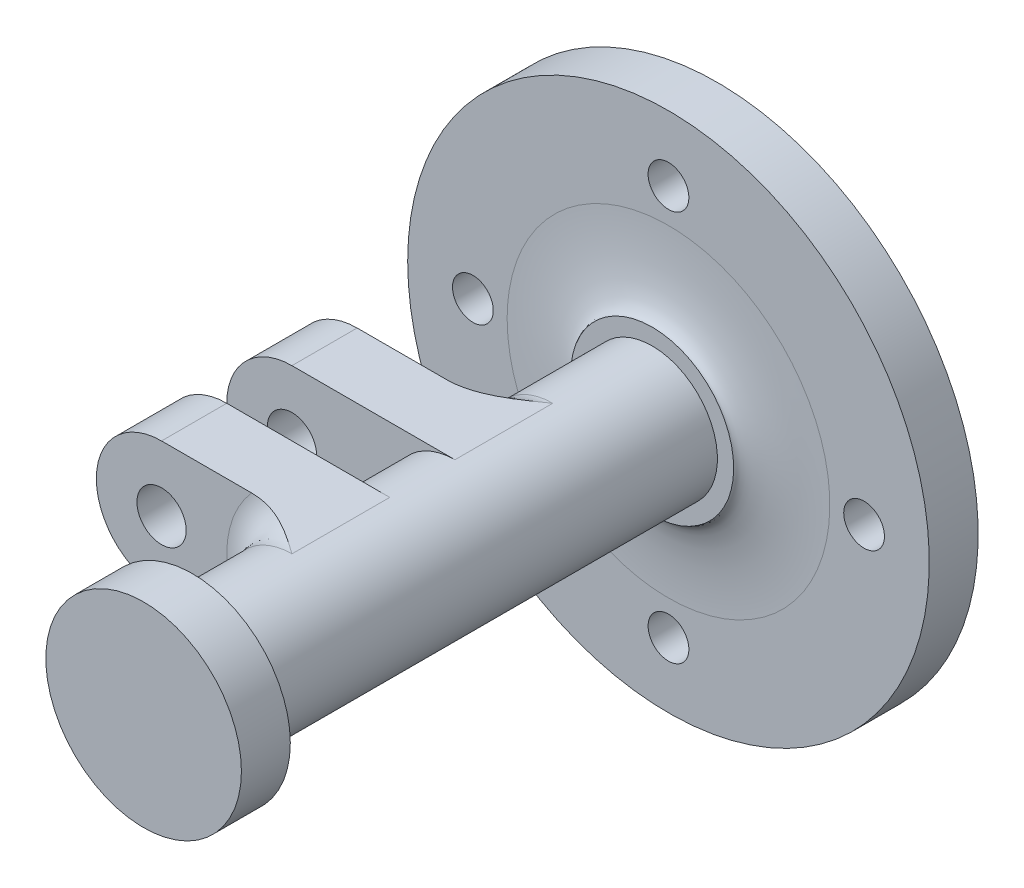
ISO-10303-21;
HEADER;
FILE_DESCRIPTION(('STEP AP214'),'2;1');
FILE_NAME('part.step','',(''),(''),'','','');
FILE_SCHEMA(('AUTOMOTIVE_DESIGN { 1 0 10303 214 1 1 1 1 }'));
ENDSEC;
DATA;
#1=APPLICATION_CONTEXT('core data for automotive mechanical design processes');
#2=APPLICATION_PROTOCOL_DEFINITION('international standard','automotive_design',2000,#1);
#3=PRODUCT_CONTEXT('',#1,'mechanical');
#4=PRODUCT('Part','Part','',(#3));
#5=PRODUCT_RELATED_PRODUCT_CATEGORY('part','',(#4));
#6=PRODUCT_DEFINITION_FORMATION('','',#4);
#7=PRODUCT_DEFINITION_CONTEXT('part definition',#1,'design');
#8=PRODUCT_DEFINITION('design','',#6,#7);
#9=PRODUCT_DEFINITION_SHAPE('','',#8);
#10=(LENGTH_UNIT() NAMED_UNIT(*) SI_UNIT(.MILLI.,.METRE.));
#11=(NAMED_UNIT(*) PLANE_ANGLE_UNIT() SI_UNIT($,.RADIAN.));
#12=(NAMED_UNIT(*) SI_UNIT($,.STERADIAN.) SOLID_ANGLE_UNIT());
#13=UNCERTAINTY_MEASURE_WITH_UNIT(LENGTH_MEASURE(1.E-05),#10,'distance_accuracy_value','');
#14=(GEOMETRIC_REPRESENTATION_CONTEXT(3) GLOBAL_UNCERTAINTY_ASSIGNED_CONTEXT((#13)) GLOBAL_UNIT_ASSIGNED_CONTEXT((#10,
#11,#12)) REPRESENTATION_CONTEXT('',''));
#15=CARTESIAN_POINT('',(0.,0.,0.));
#16=DIRECTION('',(0.,0.,1.));
#17=DIRECTION('',(1.,0.,0.));
#18=AXIS2_PLACEMENT_3D('',#15,#16,#17);
#19=CARTESIAN_POINT('',(0.,0.,14.1));
#20=DIRECTION('',(0.,0.,-1.));
#21=DIRECTION('',(-1.,0.,0.));
#22=AXIS2_PLACEMENT_3D('',#19,#20,#21);
#23=CYLINDRICAL_SURFACE('',#22,4.);
#24=CARTESIAN_POINT('',(0.,0.,-8.));
#25=DIRECTION('',(0.,0.,-1.));
#26=DIRECTION('',(-1.,0.,0.));
#27=AXIS2_PLACEMENT_3D('',#24,#25,#26);
#28=CIRCLE('',#27,4.);
#29=CARTESIAN_POINT('',(0.,-4.,-8.));
#30=VERTEX_POINT('',#29);
#31=CARTESIAN_POINT('',(0.,4.,-8.));
#32=VERTEX_POINT('',#31);
#33=EDGE_CURVE('E220',#30,#32,#28,.T.);
#34=ORIENTED_EDGE('',*,*,#33,.T.);
#35=DIRECTION('',(0.,0.,1.));
#36=VECTOR('',#35,1.);
#37=CARTESIAN_POINT('',(0.,4.,-6.));
#38=LINE('',#37,#36);
#39=CARTESIAN_POINT('',(0.,4.,-2.));
#40=VERTEX_POINT('',#39);
#41=EDGE_CURVE('E154',#32,#40,#38,.T.);
#42=ORIENTED_EDGE('',*,*,#41,.T.);
#43=CARTESIAN_POINT('',(0.,0.,-2.));
#44=DIRECTION('',(0.,0.,-1.));
#45=DIRECTION('',(-1.,0.,0.));
#46=AXIS2_PLACEMENT_3D('',#43,#44,#45);
#47=CIRCLE('',#46,4.);
#48=CARTESIAN_POINT('',(0.,-4.,-2.));
#49=VERTEX_POINT('',#48);
#50=EDGE_CURVE('E214',#49,#40,#47,.T.);
#51=ORIENTED_EDGE('',*,*,#50,.F.);
#52=DIRECTION('',(0.,0.,1.));
#53=VECTOR('',#52,1.);
#54=CARTESIAN_POINT('',(0.,-4.,-6.));
#55=LINE('',#54,#53);
#56=EDGE_CURVE('E147',#30,#49,#55,.T.);
#57=ORIENTED_EDGE('',*,*,#56,.F.);
#58=EDGE_LOOP('',(#34,#42,#51,#57));
#59=FACE_BOUND('',#58,.T.);
#60=CARTESIAN_POINT('',(0.,0.,-14.1));
#61=DIRECTION('',(0.,0.,-1.));
#62=DIRECTION('',(-1.,0.,0.));
#63=AXIS2_PLACEMENT_3D('',#60,#61,#62);
#64=CIRCLE('',#63,4.);
#65=CARTESIAN_POINT('',(-4.,0.,-14.1));
#66=VERTEX_POINT('',#65);
#67=EDGE_CURVE('E167',#66,#66,#64,.T.);
#68=ORIENTED_EDGE('',*,*,#67,.F.);
#69=EDGE_LOOP('',(#68));
#70=FACE_BOUND('',#69,.T.);
#71=CARTESIAN_POINT('',(0.,0.,14.1));
#72=DIRECTION('',(0.,0.,1.));
#73=DIRECTION('',(1.,0.,0.));
#74=AXIS2_PLACEMENT_3D('',#71,#72,#73);
#75=CIRCLE('',#74,4.);
#76=CARTESIAN_POINT('',(4.,0.,14.1));
#77=VERTEX_POINT('',#76);
#78=EDGE_CURVE('E206',#77,#77,#75,.T.);
#79=ORIENTED_EDGE('',*,*,#78,.F.);
#80=EDGE_LOOP('',(#79));
#81=FACE_BOUND('',#80,.T.);
#82=DIRECTION('',(0.,0.,-1.));
#83=VECTOR('',#82,1.);
#84=CARTESIAN_POINT('',(0.,4.,6.));
#85=LINE('',#84,#83);
#86=CARTESIAN_POINT('',(0.,4.,8.));
#87=VERTEX_POINT('',#86);
#88=CARTESIAN_POINT('',(0.,4.,2.));
#89=VERTEX_POINT('',#88);
#90=EDGE_CURVE('E199',#87,#89,#85,.T.);
#91=ORIENTED_EDGE('',*,*,#90,.F.);
#92=CARTESIAN_POINT('',(0.,0.,8.));
#93=DIRECTION('',(0.,0.,-1.));
#94=DIRECTION('',(-1.,0.,0.));
#95=AXIS2_PLACEMENT_3D('',#92,#93,#94);
#96=CIRCLE('',#95,4.);
#97=CARTESIAN_POINT('',(0.,-4.,8.));
#98=VERTEX_POINT('',#97);
#99=EDGE_CURVE('E223',#87,#98,#96,.F.);
#100=ORIENTED_EDGE('',*,*,#99,.T.);
#101=DIRECTION('',(0.,0.,-1.));
#102=VECTOR('',#101,1.);
#103=CARTESIAN_POINT('',(0.,-4.,6.));
#104=LINE('',#103,#102);
#105=CARTESIAN_POINT('',(0.,-4.,2.));
#106=VERTEX_POINT('',#105);
#107=EDGE_CURVE('E196',#98,#106,#104,.T.);
#108=ORIENTED_EDGE('',*,*,#107,.T.);
#109=CARTESIAN_POINT('',(0.,0.,2.));
#110=DIRECTION('',(0.,0.,-1.));
#111=DIRECTION('',(-1.,0.,0.));
#112=AXIS2_PLACEMENT_3D('',#109,#110,#111);
#113=CIRCLE('',#112,4.);
#114=EDGE_CURVE('E211',#106,#89,#113,.T.);
#115=ORIENTED_EDGE('',*,*,#114,.T.);
#116=EDGE_LOOP('',(#91,#100,#108,#115));
#117=FACE_BOUND('',#116,.T.);
#118=ADVANCED_FACE('F45',(#59,#70,#81,#117),#23,.T.);
#119=CARTESIAN_POINT('',(0.,0.,17.1));
#120=DIRECTION('',(0.,0.,-1.));
#121=DIRECTION('',(-1.,0.,0.));
#122=AXIS2_PLACEMENT_3D('',#119,#120,#121);
#123=CYLINDRICAL_SURFACE('',#122,6.);
#124=CARTESIAN_POINT('',(0.,0.,17.1));
#125=DIRECTION('',(0.,0.,1.));
#126=DIRECTION('',(1.,0.,0.));
#127=AXIS2_PLACEMENT_3D('',#124,#125,#126);
#128=CIRCLE('',#127,6.);
#129=CARTESIAN_POINT('',(6.,0.,17.1));
#130=VERTEX_POINT('',#129);
#131=EDGE_CURVE('E203',#130,#130,#128,.T.);
#132=ORIENTED_EDGE('',*,*,#131,.F.);
#133=EDGE_LOOP('',(#132));
#134=FACE_BOUND('',#133,.T.);
#135=CARTESIAN_POINT('',(0.,0.,14.1));
#136=DIRECTION('',(0.,0.,1.));
#137=DIRECTION('',(1.,0.,0.));
#138=AXIS2_PLACEMENT_3D('',#135,#136,#137);
#139=CIRCLE('',#138,6.);
#140=CARTESIAN_POINT('',(6.,0.,14.1));
#141=VERTEX_POINT('',#140);
#142=EDGE_CURVE('E195',#141,#141,#139,.T.);
#143=ORIENTED_EDGE('',*,*,#142,.T.);
#144=EDGE_LOOP('',(#143));
#145=FACE_BOUND('',#144,.T.);
#146=ADVANCED_FACE('F263',(#134,#145),#123,.T.);
#147=CARTESIAN_POINT('',(0.,0.,17.1));
#148=DIRECTION('',(0.,0.,1.));
#149=DIRECTION('',(1.,0.,0.));
#150=AXIS2_PLACEMENT_3D('',#147,#148,#149);
#151=PLANE('',#150);
#152=ORIENTED_EDGE('',*,*,#131,.T.);
#153=EDGE_LOOP('',(#152));
#154=FACE_BOUND('',#153,.T.);
#155=ADVANCED_FACE('F260',(#154),#151,.T.);
#156=CARTESIAN_POINT('',(0.,0.,14.1));
#157=DIRECTION('',(0.,0.,1.));
#158=DIRECTION('',(1.,0.,0.));
#159=AXIS2_PLACEMENT_3D('',#156,#157,#158);
#160=PLANE('',#159);
#161=ORIENTED_EDGE('',*,*,#78,.T.);
#162=EDGE_LOOP('',(#161));
#163=FACE_BOUND('',#162,.T.);
#164=ORIENTED_EDGE('',*,*,#142,.F.);
#165=EDGE_LOOP('',(#164));
#166=FACE_BOUND('',#165,.T.);
#167=ADVANCED_FACE('F258',(#163,#166),#160,.F.);
#168=CARTESIAN_POINT('',(-10.,0.,6.));
#169=DIRECTION('',(0.,0.,-1.));
#170=DIRECTION('',(-1.,0.,0.));
#171=AXIS2_PLACEMENT_3D('',#168,#169,#170);
#172=CYLINDRICAL_SURFACE('',#171,4.);
#173=CARTESIAN_POINT('',(-10.,0.,2.));
#174=DIRECTION('',(0.,0.,-1.));
#175=DIRECTION('',(-1.,0.,0.));
#176=AXIS2_PLACEMENT_3D('',#173,#174,#175);
#177=CIRCLE('',#176,4.);
#178=CARTESIAN_POINT('',(-10.,-4.,2.));
#179=VERTEX_POINT('',#178);
#180=CARTESIAN_POINT('',(-10.,4.,2.));
#181=VERTEX_POINT('',#180);
#182=EDGE_CURVE('E174',#179,#181,#177,.T.);
#183=ORIENTED_EDGE('',*,*,#182,.F.);
#184=DIRECTION('',(0.,0.,-1.));
#185=VECTOR('',#184,1.);
#186=CARTESIAN_POINT('',(-10.,-4.,6.));
#187=LINE('',#186,#185);
#188=CARTESIAN_POINT('',(-10.,-4.,6.));
#189=VERTEX_POINT('',#188);
#190=EDGE_CURVE('E193',#189,#179,#187,.T.);
#191=ORIENTED_EDGE('',*,*,#190,.F.);
#192=CARTESIAN_POINT('',(-10.,0.,6.));
#193=DIRECTION('',(0.,0.,-1.));
#194=DIRECTION('',(-1.,0.,0.));
#195=AXIS2_PLACEMENT_3D('',#192,#193,#194);
#196=CIRCLE('',#195,4.);
#197=CARTESIAN_POINT('',(-10.,4.,6.));
#198=VERTEX_POINT('',#197);
#199=EDGE_CURVE('E177',#189,#198,#196,.T.);
#200=ORIENTED_EDGE('',*,*,#199,.T.);
#201=DIRECTION('',(0.,0.,-1.));
#202=VECTOR('',#201,1.);
#203=CARTESIAN_POINT('',(-10.,4.,6.));
#204=LINE('',#203,#202);
#205=EDGE_CURVE('E186',#198,#181,#204,.T.);
#206=ORIENTED_EDGE('',*,*,#205,.T.);
#207=EDGE_LOOP('',(#183,#191,#200,#206));
#208=FACE_BOUND('',#207,.T.);
#209=ADVANCED_FACE('F255',(#208),#172,.T.);
#210=CARTESIAN_POINT('',(-10.,-4.,6.));
#211=DIRECTION('',(0.,-1.,0.));
#212=DIRECTION('',(0.,0.,-1.));
#213=AXIS2_PLACEMENT_3D('',#210,#211,#212);
#214=PLANE('',#213);
#215=DIRECTION('',(-1.,0.,0.));
#216=VECTOR('',#215,1.);
#217=CARTESIAN_POINT('',(-10.,-4.,2.));
#218=LINE('',#217,#216);
#219=EDGE_CURVE('E181',#106,#179,#218,.T.);
#220=ORIENTED_EDGE('',*,*,#219,.F.);
#221=ORIENTED_EDGE('',*,*,#107,.F.);
#222=CARTESIAN_POINT('',(-4.47213595499958,-4.,6.));
#223=CARTESIAN_POINT('',(-4.35334359731727,-4.,6.00001024401907));
#224=CARTESIAN_POINT('',(-4.23469314670311,-4.,6.00587622658887));
#225=CARTESIAN_POINT('',(-3.99859891424026,-4.,6.02808665591263));
#226=CARTESIAN_POINT('',(-3.88115319741225,-4.,6.04441017611719));
#227=CARTESIAN_POINT('',(-3.53520291074407,-4.,6.10656076269327));
#228=CARTESIAN_POINT('',(-3.30906372489476,-4.,6.16565492945821));
#229=CARTESIAN_POINT('',(-2.84508071295032,-4.,6.31803538332929));
#230=CARTESIAN_POINT('',(-2.60817008180991,-4.,6.41403969988759));
#231=CARTESIAN_POINT('',(-2.14516709447212,-4.,6.62957478686055));
#232=CARTESIAN_POINT('',(-1.91909148826652,-4.,6.74914060984285));
#233=CARTESIAN_POINT('',(-1.47418805175543,-4.,7.00514512317495));
#234=CARTESIAN_POINT('',(-1.25544428549517,-4.,7.14172666252827));
#235=CARTESIAN_POINT('',(-0.824306852386631,-4.,7.42418284041456));
#236=CARTESIAN_POINT('',(-0.611910368567943,-4.,7.57005326370043));
#237=CARTESIAN_POINT('',(-0.270297196766632,-3.99999999999999,7.80889896384493));
#238=CARTESIAN_POINT('',(-0.14030705977901,-3.99999999999999,7.9007886474796));
#239=CARTESIAN_POINT('',(-0.00688530460870534,-4.,7.9951313540674));
#240=CARTESIAN_POINT('',(-0.00344265276683976,-4.,7.99756567652484));
#241=CARTESIAN_POINT('',(0.,-4.,8.));
#242=B_SPLINE_CURVE_WITH_KNOTS('',3,(#222,#223,#224,#225,#226,#227,#228,#229,#230,#231,#232,
#233,#234,#235,#236,#237,#238,#239,#240,#241),.UNSPECIFIED.,.F.,.F.,(4,2,2,2,2,2,2,2,2,4),(0.,
0.356013544585943,0.711316887353405,1.41000592210095,2.17516485328382,2.94147082800576,
3.71470886546806,4.48759847817231,4.96517109874123,4.97782020938191),.UNSPECIFIED.);
#243=CARTESIAN_POINT('',(-4.47213595499958,-4.,6.));
#244=VERTEX_POINT('',#243);
#245=EDGE_CURVE('E236',#98,#244,#242,.F.);
#246=ORIENTED_EDGE('',*,*,#245,.T.);
#247=DIRECTION('',(-1.,0.,0.));
#248=VECTOR('',#247,1.);
#249=CARTESIAN_POINT('',(-10.,-4.,6.));
#250=LINE('',#249,#248);
#251=EDGE_CURVE('E184',#244,#189,#250,.T.);
#252=ORIENTED_EDGE('',*,*,#251,.T.);
#253=ORIENTED_EDGE('',*,*,#190,.T.);
#254=EDGE_LOOP('',(#220,#221,#246,#252,#253));
#255=FACE_BOUND('',#254,.T.);
#256=ADVANCED_FACE('F251',(#255),#214,.T.);
#257=CARTESIAN_POINT('',(-10.,4.,6.));
#258=DIRECTION('',(0.,1.,0.));
#259=DIRECTION('',(0.,0.,1.));
#260=AXIS2_PLACEMENT_3D('',#257,#258,#259);
#261=PLANE('',#260);
#262=DIRECTION('',(1.,0.,0.));
#263=VECTOR('',#262,1.);
#264=CARTESIAN_POINT('',(-10.,4.,2.));
#265=LINE('',#264,#263);
#266=EDGE_CURVE('E189',#181,#89,#265,.T.);
#267=ORIENTED_EDGE('',*,*,#266,.F.);
#268=ORIENTED_EDGE('',*,*,#205,.F.);
#269=DIRECTION('',(1.,0.,0.));
#270=VECTOR('',#269,1.);
#271=CARTESIAN_POINT('',(-10.,4.,6.));
#272=LINE('',#271,#270);
#273=CARTESIAN_POINT('',(-4.47213595499958,4.,6.));
#274=VERTEX_POINT('',#273);
#275=EDGE_CURVE('E180',#198,#274,#272,.T.);
#276=ORIENTED_EDGE('',*,*,#275,.T.);
#277=CARTESIAN_POINT('',(-4.47213595499958,4.,6.));
#278=CARTESIAN_POINT('',(-4.35334359731727,4.,6.00001024401907));
#279=CARTESIAN_POINT('',(-4.23469314670311,4.,6.00587622658887));
#280=CARTESIAN_POINT('',(-3.99859891424026,4.,6.02808665591263));
#281=CARTESIAN_POINT('',(-3.88115319741225,4.,6.04441017611719));
#282=CARTESIAN_POINT('',(-3.53520291074407,4.,6.10656076269327));
#283=CARTESIAN_POINT('',(-3.30906372489476,4.,6.16565492945821));
#284=CARTESIAN_POINT('',(-2.84508071295032,4.,6.31803538332929));
#285=CARTESIAN_POINT('',(-2.60817008180991,4.,6.41403969988759));
#286=CARTESIAN_POINT('',(-2.14516709447212,4.,6.62957478686055));
#287=CARTESIAN_POINT('',(-1.91909148826652,4.,6.74914060984285));
#288=CARTESIAN_POINT('',(-1.47418805175543,4.,7.00514512317495));
#289=CARTESIAN_POINT('',(-1.25544428549517,4.,7.14172666252827));
#290=CARTESIAN_POINT('',(-0.824306852386631,4.,7.42418284041456));
#291=CARTESIAN_POINT('',(-0.611910368567943,4.,7.57005326370043));
#292=CARTESIAN_POINT('',(-0.270297196766632,3.99999999999999,7.80889896384493));
#293=CARTESIAN_POINT('',(-0.14030705977901,3.99999999999999,7.9007886474796));
#294=CARTESIAN_POINT('',(-0.00688530460870534,4.,7.9951313540674));
#295=CARTESIAN_POINT('',(-0.00344265276683976,4.,7.99756567652484));
#296=CARTESIAN_POINT('',(0.,4.,8.));
#297=B_SPLINE_CURVE_WITH_KNOTS('',3,(#277,#278,#279,#280,#281,#282,#283,#284,#285,#286,#287,
#288,#289,#290,#291,#292,#293,#294,#295,#296),.UNSPECIFIED.,.F.,.F.,(4,2,2,2,2,2,2,2,2,4),(0.,
0.356013544585943,0.711316887353405,1.41000592210095,2.17516485328382,2.94147082800576,
3.71470886546806,4.48759847817231,4.96517109874123,4.97782020938191),.UNSPECIFIED.);
#298=EDGE_CURVE('E227',#274,#87,#297,.T.);
#299=ORIENTED_EDGE('',*,*,#298,.T.);
#300=ORIENTED_EDGE('',*,*,#90,.T.);
#301=EDGE_LOOP('',(#267,#268,#276,#299,#300));
#302=FACE_BOUND('',#301,.T.);
#303=ADVANCED_FACE('F246',(#302),#261,.T.);
#304=CARTESIAN_POINT('',(-10.,0.,6.));
#305=DIRECTION('',(0.,0.,-1.));
#306=DIRECTION('',(-1.,0.,0.));
#307=AXIS2_PLACEMENT_3D('',#304,#305,#306);
#308=PLANE('',#307);
#309=CARTESIAN_POINT('',(-10.,0.,6.));
#310=DIRECTION('',(0.,0.,-1.));
#311=DIRECTION('',(-1.,0.,0.));
#312=AXIS2_PLACEMENT_3D('',#309,#310,#311);
#313=CIRCLE('',#312,1.51);
#314=CARTESIAN_POINT('',(-11.51,0.,6.));
#315=VERTEX_POINT('',#314);
#316=EDGE_CURVE('E171',#315,#315,#313,.T.);
#317=ORIENTED_EDGE('',*,*,#316,.T.);
#318=EDGE_LOOP('',(#317));
#319=FACE_BOUND('',#318,.T.);
#320=ORIENTED_EDGE('',*,*,#251,.F.);
#321=CARTESIAN_POINT('',(0.,0.,6.));
#322=DIRECTION('',(0.,0.,-1.));
#323=DIRECTION('',(-1.,0.,0.));
#324=AXIS2_PLACEMENT_3D('',#321,#322,#323);
#325=CIRCLE('',#324,6.);
#326=EDGE_CURVE('E217',#244,#274,#325,.T.);
#327=ORIENTED_EDGE('',*,*,#326,.T.);
#328=ORIENTED_EDGE('',*,*,#275,.F.);
#329=ORIENTED_EDGE('',*,*,#199,.F.);
#330=EDGE_LOOP('',(#320,#327,#328,#329));
#331=FACE_BOUND('',#330,.T.);
#332=ADVANCED_FACE('F250',(#319,#331),#308,.F.);
#333=CARTESIAN_POINT('',(-10.,0.,2.));
#334=DIRECTION('',(0.,0.,-1.));
#335=DIRECTION('',(-1.,0.,0.));
#336=AXIS2_PLACEMENT_3D('',#333,#334,#335);
#337=PLANE('',#336);
#338=ORIENTED_EDGE('',*,*,#114,.F.);
#339=ORIENTED_EDGE('',*,*,#219,.T.);
#340=ORIENTED_EDGE('',*,*,#182,.T.);
#341=ORIENTED_EDGE('',*,*,#266,.T.);
#342=EDGE_LOOP('',(#338,#339,#340,#341));
#343=FACE_BOUND('',#342,.T.);
#344=CARTESIAN_POINT('',(-10.,0.,2.));
#345=DIRECTION('',(0.,0.,-1.));
#346=DIRECTION('',(-1.,0.,0.));
#347=AXIS2_PLACEMENT_3D('',#344,#345,#346);
#348=CIRCLE('',#347,1.51);
#349=CARTESIAN_POINT('',(-11.51,0.,2.));
#350=VERTEX_POINT('',#349);
#351=EDGE_CURVE('E170',#350,#350,#348,.T.);
#352=ORIENTED_EDGE('',*,*,#351,.F.);
#353=EDGE_LOOP('',(#352));
#354=FACE_BOUND('',#353,.T.);
#355=ADVANCED_FACE('F317',(#343,#354),#337,.T.);
#356=CARTESIAN_POINT('',(-10.,0.,6.));
#357=DIRECTION('',(0.,0.,-1.));
#358=DIRECTION('',(-1.,0.,0.));
#359=AXIS2_PLACEMENT_3D('',#356,#357,#358);
#360=CYLINDRICAL_SURFACE('',#359,1.51);
#361=ORIENTED_EDGE('',*,*,#316,.F.);
#362=EDGE_LOOP('',(#361));
#363=FACE_BOUND('',#362,.T.);
#364=ORIENTED_EDGE('',*,*,#351,.T.);
#365=EDGE_LOOP('',(#364));
#366=FACE_BOUND('',#365,.T.);
#367=ADVANCED_FACE('F314',(#363,#366),#360,.F.);
#368=CARTESIAN_POINT('',(0.,0.,-6.));
#369=DIRECTION('',(0.,0.,-1.));
#370=DIRECTION('',(-1.,0.,0.));
#371=AXIS2_PLACEMENT_3D('',#368,#369,#370);
#372=PLANE('',#371);
#373=DIRECTION('',(1.,0.,0.));
#374=VECTOR('',#373,1.);
#375=CARTESIAN_POINT('',(0.,4.,-6.));
#376=LINE('',#375,#374);
#377=CARTESIAN_POINT('',(-10.,4.,-6.));
#378=VERTEX_POINT('',#377);
#379=CARTESIAN_POINT('',(-4.47213595499958,4.,-6.));
#380=VERTEX_POINT('',#379);
#381=EDGE_CURVE('E152',#378,#380,#376,.T.);
#382=ORIENTED_EDGE('',*,*,#381,.T.);
#383=CARTESIAN_POINT('',(0.,0.,-6.));
#384=DIRECTION('',(0.,0.,-1.));
#385=DIRECTION('',(-1.,0.,0.));
#386=AXIS2_PLACEMENT_3D('',#383,#384,#385);
#387=CIRCLE('',#386,6.);
#388=CARTESIAN_POINT('',(-4.47213595499958,-4.,-6.));
#389=VERTEX_POINT('',#388);
#390=EDGE_CURVE('E74',#380,#389,#387,.F.);
#391=ORIENTED_EDGE('',*,*,#390,.T.);
#392=DIRECTION('',(-1.,0.,0.));
#393=VECTOR('',#392,1.);
#394=CARTESIAN_POINT('',(0.,-4.,-6.));
#395=LINE('',#394,#393);
#396=CARTESIAN_POINT('',(-10.,-4.,-6.));
#397=VERTEX_POINT('',#396);
#398=EDGE_CURVE('E127',#389,#397,#395,.T.);
#399=ORIENTED_EDGE('',*,*,#398,.T.);
#400=CARTESIAN_POINT('',(-10.,0.,-6.));
#401=DIRECTION('',(0.,0.,-1.));
#402=DIRECTION('',(-1.,0.,0.));
#403=AXIS2_PLACEMENT_3D('',#400,#401,#402);
#404=CIRCLE('',#403,4.);
#405=EDGE_CURVE('E132',#397,#378,#404,.T.);
#406=ORIENTED_EDGE('',*,*,#405,.T.);
#407=EDGE_LOOP('',(#382,#391,#399,#406));
#408=FACE_BOUND('',#407,.T.);
#409=CARTESIAN_POINT('',(-10.,0.,-6.));
#410=DIRECTION('',(0.,0.,-1.));
#411=DIRECTION('',(-1.,0.,0.));
#412=AXIS2_PLACEMENT_3D('',#409,#410,#411);
#413=CIRCLE('',#412,1.51);
#414=CARTESIAN_POINT('',(-11.51,0.,-6.));
#415=VERTEX_POINT('',#414);
#416=EDGE_CURVE('E160',#415,#415,#413,.T.);
#417=ORIENTED_EDGE('',*,*,#416,.F.);
#418=EDGE_LOOP('',(#417));
#419=FACE_BOUND('',#418,.T.);
#420=ADVANCED_FACE('F129',(#408,#419),#372,.T.);
#421=CARTESIAN_POINT('',(0.,0.,-2.));
#422=DIRECTION('',(0.,0.,-1.));
#423=DIRECTION('',(-1.,0.,0.));
#424=AXIS2_PLACEMENT_3D('',#421,#422,#423);
#425=PLANE('',#424);
#426=DIRECTION('',(-1.,0.,0.));
#427=VECTOR('',#426,1.);
#428=CARTESIAN_POINT('',(0.,-4.,-2.));
#429=LINE('',#428,#427);
#430=CARTESIAN_POINT('',(-10.,-4.,-2.));
#431=VERTEX_POINT('',#430);
#432=EDGE_CURVE('E144',#49,#431,#429,.T.);
#433=ORIENTED_EDGE('',*,*,#432,.F.);
#434=ORIENTED_EDGE('',*,*,#50,.T.);
#435=DIRECTION('',(1.,0.,0.));
#436=VECTOR('',#435,1.);
#437=CARTESIAN_POINT('',(0.,4.,-2.));
#438=LINE('',#437,#436);
#439=CARTESIAN_POINT('',(-10.,4.,-2.));
#440=VERTEX_POINT('',#439);
#441=EDGE_CURVE('E137',#440,#40,#438,.T.);
#442=ORIENTED_EDGE('',*,*,#441,.F.);
#443=CARTESIAN_POINT('',(-10.,0.,-2.));
#444=DIRECTION('',(0.,0.,-1.));
#445=DIRECTION('',(-1.,0.,0.));
#446=AXIS2_PLACEMENT_3D('',#443,#444,#445);
#447=CIRCLE('',#446,4.);
#448=EDGE_CURVE('E159',#431,#440,#447,.T.);
#449=ORIENTED_EDGE('',*,*,#448,.F.);
#450=EDGE_LOOP('',(#433,#434,#442,#449));
#451=FACE_BOUND('',#450,.T.);
#452=CARTESIAN_POINT('',(-10.,0.,-2.));
#453=DIRECTION('',(0.,0.,-1.));
#454=DIRECTION('',(-1.,0.,0.));
#455=AXIS2_PLACEMENT_3D('',#452,#453,#454);
#456=CIRCLE('',#455,1.51);
#457=CARTESIAN_POINT('',(-11.51,0.,-2.));
#458=VERTEX_POINT('',#457);
#459=EDGE_CURVE('E594',#458,#458,#456,.T.);
#460=ORIENTED_EDGE('',*,*,#459,.T.);
#461=EDGE_LOOP('',(#460));
#462=FACE_BOUND('',#461,.T.);
#463=ADVANCED_FACE('F308',(#451,#462),#425,.F.);
#464=CARTESIAN_POINT('',(0.,-4.,-6.));
#465=DIRECTION('',(0.,1.,0.));
#466=DIRECTION('',(-1.,0.,0.));
#467=AXIS2_PLACEMENT_3D('',#464,#465,#466);
#468=PLANE('',#467);
#469=ORIENTED_EDGE('',*,*,#432,.T.);
#470=DIRECTION('',(0.,0.,1.));
#471=VECTOR('',#470,1.);
#472=CARTESIAN_POINT('',(-10.,-4.,-6.));
#473=LINE('',#472,#471);
#474=EDGE_CURVE('E140',#397,#431,#473,.T.);
#475=ORIENTED_EDGE('',*,*,#474,.F.);
#476=ORIENTED_EDGE('',*,*,#398,.F.);
#477=CARTESIAN_POINT('',(-4.47213595499958,-4.,-6.));
#478=CARTESIAN_POINT('',(-4.35334359731724,-4.,-6.00001024401907));
#479=CARTESIAN_POINT('',(-4.23469314670304,-4.,-6.00587622658888));
#480=CARTESIAN_POINT('',(-3.99859891424014,-4.,-6.02808665591264));
#481=CARTESIAN_POINT('',(-3.88115319741211,-4.,-6.04441017611721));
#482=CARTESIAN_POINT('',(-3.53520291074396,-4.,-6.1065607626933));
#483=CARTESIAN_POINT('',(-3.3090637248947,-4.,-6.16565492945823));
#484=CARTESIAN_POINT('',(-2.84508071295033,-4.,-6.31803538332929));
#485=CARTESIAN_POINT('',(-2.60817008180992,-4.,-6.41403969988758));
#486=CARTESIAN_POINT('',(-2.14516709447217,-4.,-6.62957478686053));
#487=CARTESIAN_POINT('',(-1.91909148826661,-4.,-6.74914060984285));
#488=CARTESIAN_POINT('',(-1.47418805175548,-4.,-7.00514512317488));
#489=CARTESIAN_POINT('',(-1.25544428549514,-4.,-7.14172666252812));
#490=CARTESIAN_POINT('',(-0.824306852386726,-4.,-7.42418284041467));
#491=CARTESIAN_POINT('',(-0.611910368568237,-4.,-7.57005326370088));
#492=CARTESIAN_POINT('',(-0.270297196766409,-4.,-7.80889896384468));
#493=CARTESIAN_POINT('',(-0.140307059778403,-4.,-7.90078864747877));
#494=CARTESIAN_POINT('',(-0.00688530460867387,-4.,-7.99513135406736));
#495=CARTESIAN_POINT('',(-0.00344265276682351,-4.,-7.99756567652482));
#496=CARTESIAN_POINT('',(0.,-4.,-8.));
#497=B_SPLINE_CURVE_WITH_KNOTS('',3,(#477,#478,#479,#480,#481,#482,#483,#484,#485,#486,#487,
#488,#489,#490,#491,#492,#493,#494,#495,#496),.UNSPECIFIED.,.F.,.F.,(4,2,2,2,2,2,2,2,2,4),(0.,
0.356013544586033,0.711316887353571,1.41000592210095,2.1751648532838,2.94147082800565,
3.71470886546801,4.48759847817235,4.96517109874123,4.97782020938191),.UNSPECIFIED.);
#498=EDGE_CURVE('E60',#389,#30,#497,.T.);
#499=ORIENTED_EDGE('',*,*,#498,.T.);
#500=ORIENTED_EDGE('',*,*,#56,.T.);
#501=EDGE_LOOP('',(#469,#475,#476,#499,#500));
#502=FACE_BOUND('',#501,.T.);
#503=ADVANCED_FACE('F141',(#502),#468,.F.);
#504=CARTESIAN_POINT('',(-10.,0.,-6.));
#505=DIRECTION('',(0.,0.,1.));
#506=DIRECTION('',(1.,0.,0.));
#507=AXIS2_PLACEMENT_3D('',#504,#505,#506);
#508=CYLINDRICAL_SURFACE('',#507,4.);
#509=ORIENTED_EDGE('',*,*,#448,.T.);
#510=DIRECTION('',(0.,0.,1.));
#511=VECTOR('',#510,1.);
#512=CARTESIAN_POINT('',(-10.,4.,-6.));
#513=LINE('',#512,#511);
#514=EDGE_CURVE('E148',#378,#440,#513,.T.);
#515=ORIENTED_EDGE('',*,*,#514,.F.);
#516=ORIENTED_EDGE('',*,*,#405,.F.);
#517=ORIENTED_EDGE('',*,*,#474,.T.);
#518=EDGE_LOOP('',(#509,#515,#516,#517));
#519=FACE_BOUND('',#518,.T.);
#520=ADVANCED_FACE('F150',(#519),#508,.T.);
#521=CARTESIAN_POINT('',(0.,4.,-6.));
#522=DIRECTION('',(0.,-1.,0.));
#523=DIRECTION('',(1.,0.,0.));
#524=AXIS2_PLACEMENT_3D('',#521,#522,#523);
#525=PLANE('',#524);
#526=ORIENTED_EDGE('',*,*,#441,.T.);
#527=ORIENTED_EDGE('',*,*,#41,.F.);
#528=CARTESIAN_POINT('',(-4.47213595499958,4.,-6.));
#529=CARTESIAN_POINT('',(-4.35334359731724,4.,-6.00001024401907));
#530=CARTESIAN_POINT('',(-4.23469314670304,4.,-6.00587622658888));
#531=CARTESIAN_POINT('',(-3.99859891424014,4.,-6.02808665591264));
#532=CARTESIAN_POINT('',(-3.88115319741211,4.,-6.04441017611721));
#533=CARTESIAN_POINT('',(-3.53520291074396,4.,-6.1065607626933));
#534=CARTESIAN_POINT('',(-3.3090637248947,4.,-6.16565492945823));
#535=CARTESIAN_POINT('',(-2.84508071295033,4.,-6.31803538332929));
#536=CARTESIAN_POINT('',(-2.60817008180992,4.,-6.41403969988758));
#537=CARTESIAN_POINT('',(-2.14516709447217,4.,-6.62957478686053));
#538=CARTESIAN_POINT('',(-1.91909148826661,4.,-6.74914060984285));
#539=CARTESIAN_POINT('',(-1.47418805175548,4.,-7.00514512317488));
#540=CARTESIAN_POINT('',(-1.25544428549514,4.,-7.14172666252812));
#541=CARTESIAN_POINT('',(-0.824306852386726,4.,-7.42418284041467));
#542=CARTESIAN_POINT('',(-0.611910368568237,4.,-7.57005326370088));
#543=CARTESIAN_POINT('',(-0.270297196766409,4.,-7.80889896384468));
#544=CARTESIAN_POINT('',(-0.140307059778403,4.,-7.90078864747877));
#545=CARTESIAN_POINT('',(-0.00688530460867387,4.,-7.99513135406736));
#546=CARTESIAN_POINT('',(-0.00344265276682351,4.,-7.99756567652482));
#547=CARTESIAN_POINT('',(0.,4.,-8.));
#548=B_SPLINE_CURVE_WITH_KNOTS('',3,(#528,#529,#530,#531,#532,#533,#534,#535,#536,#537,#538,
#539,#540,#541,#542,#543,#544,#545,#546,#547),.UNSPECIFIED.,.F.,.F.,(4,2,2,2,2,2,2,2,2,4),(0.,
0.356013544586033,0.711316887353571,1.41000592210095,2.1751648532838,2.94147082800565,
3.71470886546801,4.48759847817235,4.96517109874123,4.97782020938191),.UNSPECIFIED.);
#549=EDGE_CURVE('E67',#32,#380,#548,.F.);
#550=ORIENTED_EDGE('',*,*,#549,.T.);
#551=ORIENTED_EDGE('',*,*,#381,.F.);
#552=ORIENTED_EDGE('',*,*,#514,.T.);
#553=EDGE_LOOP('',(#526,#527,#550,#551,#552));
#554=FACE_BOUND('',#553,.T.);
#555=ADVANCED_FACE('F302',(#554),#525,.F.);
#556=CARTESIAN_POINT('',(-10.,0.,-6.));
#557=DIRECTION('',(0.,0.,1.));
#558=DIRECTION('',(1.,0.,0.));
#559=AXIS2_PLACEMENT_3D('',#556,#557,#558);
#560=CYLINDRICAL_SURFACE('',#559,1.51);
#561=ORIENTED_EDGE('',*,*,#416,.T.);
#562=EDGE_LOOP('',(#561));
#563=FACE_BOUND('',#562,.T.);
#564=ORIENTED_EDGE('',*,*,#459,.F.);
#565=EDGE_LOOP('',(#564));
#566=FACE_BOUND('',#565,.T.);
#567=ADVANCED_FACE('F307',(#563,#566),#560,.F.);
#568=CARTESIAN_POINT('',(0.,0.,8.));
#569=DIRECTION('',(0.,0.,-1.));
#570=DIRECTION('',(-1.,0.,0.));
#571=AXIS2_PLACEMENT_3D('',#568,#569,#570);
#572=TOROIDAL_SURFACE('',#571,6.,2.);
#573=ORIENTED_EDGE('',*,*,#245,.F.);
#574=ORIENTED_EDGE('',*,*,#99,.F.);
#575=ORIENTED_EDGE('',*,*,#298,.F.);
#576=ORIENTED_EDGE('',*,*,#326,.F.);
#577=EDGE_LOOP('',(#573,#574,#575,#576));
#578=FACE_BOUND('',#577,.T.);
#579=ADVANCED_FACE('F243',(#578),#572,.F.);
#580=CARTESIAN_POINT('',(0.,0.,-8.));
#581=DIRECTION('',(0.,0.,-1.));
#582=DIRECTION('',(-1.,0.,0.));
#583=AXIS2_PLACEMENT_3D('',#580,#581,#582);
#584=TOROIDAL_SURFACE('',#583,6.,2.);
#585=ORIENTED_EDGE('',*,*,#498,.F.);
#586=ORIENTED_EDGE('',*,*,#390,.F.);
#587=ORIENTED_EDGE('',*,*,#549,.F.);
#588=ORIENTED_EDGE('',*,*,#33,.F.);
#589=EDGE_LOOP('',(#585,#586,#587,#588));
#590=FACE_BOUND('',#589,.T.);
#591=ADVANCED_FACE('F300',(#590),#584,.F.);
#592=CARTESIAN_POINT('',(0.,0.,-14.1));
#593=DIRECTION('',(0.,0.,-1.));
#594=DIRECTION('',(-1.,0.,0.));
#595=AXIS2_PLACEMENT_3D('',#592,#593,#594);
#596=PLANE('',#595);
#597=ORIENTED_EDGE('',*,*,#67,.T.);
#598=EDGE_LOOP('',(#597));
#599=FACE_BOUND('',#598,.T.);
#600=CARTESIAN_POINT('',(-5.,0.,-14.1));
#601=CARTESIAN_POINT('',(-5.,0.654498468385362,-14.1));
#602=CARTESIAN_POINT('',(-4.8698633829155,1.30873942282473,-14.1));
#603=CARTESIAN_POINT('',(-4.36893194219737,2.51809490082617,-14.1));
#604=CARTESIAN_POINT('',(-3.99833421120365,3.07273360066098,-14.1));
#605=CARTESIAN_POINT('',(-3.07273360066182,3.9983342112045,-14.1));
#606=CARTESIAN_POINT('',(-2.51809490082608,4.36893194219724,-14.1));
#607=CARTESIAN_POINT('',(-1.30873942282482,4.86986338291564,-14.1));
#608=CARTESIAN_POINT('',(-0.654498468384665,4.99999999999944,-14.1));
#609=CARTESIAN_POINT('',(0.654498468384665,5.00000000000056,-14.1));
#610=CARTESIAN_POINT('',(1.30873942282468,4.86986338291563,-14.1));
#611=CARTESIAN_POINT('',(2.51809490082622,4.36893194219723,-14.1));
#612=CARTESIAN_POINT('',(3.07273360066154,3.99833421120393,-14.1));
#613=CARTESIAN_POINT('',(3.99833421120394,3.07273360066154,-14.1));
#614=CARTESIAN_POINT('',(4.36893194219611,2.51809490082623,-14.1));
#615=CARTESIAN_POINT('',(4.86986338291676,1.30873942282468,-14.1));
#616=CARTESIAN_POINT('',(5.,0.654498468384665,-14.1));
#617=CARTESIAN_POINT('',(5.,-0.654498468384664,-14.1));
#618=CARTESIAN_POINT('',(4.86986338291564,-1.30873942282467,-14.1));
#619=CARTESIAN_POINT('',(4.36893194219724,-2.51809490082621,-14.1));
#620=CARTESIAN_POINT('',(3.99833421120421,-3.07273360066098,-14.1));
#621=CARTESIAN_POINT('',(3.07273360066126,-3.9983342112045,-14.1));
#622=CARTESIAN_POINT('',(2.51809490082581,-4.36893194219611,-14.1));
#623=CARTESIAN_POINT('',(1.3087394228251,-4.86986338291675,-14.1));
#624=CARTESIAN_POINT('',(0.654498468384658,-5.00000000000056,-14.1));
#625=CARTESIAN_POINT('',(-0.654498468384674,-4.99999999999944,-14.1));
#626=CARTESIAN_POINT('',(-1.30873942282481,-4.86986338291732,-14.1));
#627=CARTESIAN_POINT('',(-2.51809490082607,-4.36893194219555,-14.1));
#628=CARTESIAN_POINT('',(-3.07273360066237,-3.99833421120451,-14.1));
#629=CARTESIAN_POINT('',(-3.99833421120308,-3.07273360066099,-14.1));
#630=CARTESIAN_POINT('',(-4.36893194219723,-2.51809490082637,-14.1));
#631=CARTESIAN_POINT('',(-4.86986338291563,-1.30873942282454,-14.1));
#632=CARTESIAN_POINT('',(-5.,-0.654498468385363,-14.1));
#633=CARTESIAN_POINT('',(-5.,0.,-14.1));
#634=(BOUNDED_CURVE() B_SPLINE_CURVE(3,(#600,#601,#602,#603,#604,#605,#606,#607,#608,#609,#610,
#611,#612,#613,#614,#615,#616,#617,#618,#619,#620,#621,#622,#623,#624,#625,#626,#627,#628,#629,
#630,#631,#632,#633),.UNSPECIFIED.,.T.,.F.) B_SPLINE_CURVE_WITH_KNOTS((4,2,2,2,2,2,2,2,2,2,2,2,
2,2,2,2,4),(0.,0.392699081698724,0.785398163397448,1.17809724509617,1.5707963267949,
1.96349540849362,2.35619449019234,2.74889357189107,3.14159265358979,3.53429173528852,
3.92699081698724,4.31968989868597,4.71238898038469,5.10508806208341,5.49778714378214,
5.89048622548086,6.28318530717959),
.UNSPECIFIED.) CURVE() GEOMETRIC_REPRESENTATION_ITEM() RATIONAL_B_SPLINE_CURVE((1.,1.,1.,1.,1.,
1.,1.,1.,1.,1.,1.,1.,1.,1.,1.,1.,1.,1.,1.,1.,1.,1.,1.,1.,1.,1.,1.,1.,1.,1.,1.,1.,1.,1.)) REPRESENTATION_ITEM(''));
#635=CARTESIAN_POINT('',(-5.,0.,-14.1));
#636=VERTEX_POINT('',#635);
#637=EDGE_CURVE('E596',#636,#636,#634,.T.);
#638=ORIENTED_EDGE('',*,*,#637,.F.);
#639=EDGE_LOOP('',(#638));
#640=FACE_BOUND('',#639,.T.);
#641=ADVANCED_FACE('F393',(#599,#640),#596,.F.);
#642=CARTESIAN_POINT('',(0.,0.,-18.1));
#643=DIRECTION('',(0.,0.,1.));
#644=DIRECTION('',(1.,0.,0.));
#645=AXIS2_PLACEMENT_3D('',#642,#643,#644);
#646=CYLINDRICAL_SURFACE('',#645,16.);
#647=CARTESIAN_POINT('',(0.,0.,-18.1));
#648=DIRECTION('',(0.,0.,-1.));
#649=DIRECTION('',(-1.,0.,0.));
#650=AXIS2_PLACEMENT_3D('',#647,#648,#649);
#651=CIRCLE('',#650,16.);
#652=CARTESIAN_POINT('',(-16.,0.,-18.1));
#653=VERTEX_POINT('',#652);
#654=EDGE_CURVE('E600',#653,#653,#651,.T.);
#655=ORIENTED_EDGE('',*,*,#654,.F.);
#656=EDGE_LOOP('',(#655));
#657=FACE_BOUND('',#656,.T.);
#658=CARTESIAN_POINT('',(0.,0.,-15.1));
#659=DIRECTION('',(0.,0.,-1.));
#660=DIRECTION('',(-1.,0.,0.));
#661=AXIS2_PLACEMENT_3D('',#658,#659,#660);
#662=CIRCLE('',#661,16.);
#663=CARTESIAN_POINT('',(-16.,0.,-15.1));
#664=VERTEX_POINT('',#663);
#665=EDGE_CURVE('E602',#664,#664,#662,.T.);
#666=ORIENTED_EDGE('',*,*,#665,.T.);
#667=EDGE_LOOP('',(#666));
#668=FACE_BOUND('',#667,.T.);
#669=ADVANCED_FACE('F401',(#657,#668),#646,.T.);
#670=CARTESIAN_POINT('',(0.,0.,-18.1));
#671=DIRECTION('',(0.,0.,-1.));
#672=DIRECTION('',(-1.,0.,0.));
#673=AXIS2_PLACEMENT_3D('',#670,#671,#672);
#674=PLANE('',#673);
#675=CARTESIAN_POINT('',(0.,12.,-18.1));
#676=DIRECTION('',(0.,0.,-1.));
#677=DIRECTION('',(-1.,0.,0.));
#678=AXIS2_PLACEMENT_3D('',#675,#676,#677);
#679=CIRCLE('',#678,1.25);
#680=CARTESIAN_POINT('',(-1.25,12.,-18.1));
#681=VERTEX_POINT('',#680);
#682=EDGE_CURVE('E626',#681,#681,#679,.T.);
#683=ORIENTED_EDGE('',*,*,#682,.F.);
#684=EDGE_LOOP('',(#683));
#685=FACE_BOUND('',#684,.T.);
#686=CARTESIAN_POINT('',(-12.0000000000003,3.38856148926383E-13,-18.1));
#687=DIRECTION('',(0.,0.,-1.));
#688=DIRECTION('',(-1.,0.,0.));
#689=AXIS2_PLACEMENT_3D('',#686,#687,#688);
#690=CIRCLE('',#689,1.25000000000027);
#691=CARTESIAN_POINT('',(-13.2500000000006,3.38856148926383E-13,-18.1));
#692=VERTEX_POINT('',#691);
#693=EDGE_CURVE('E618',#692,#692,#690,.T.);
#694=ORIENTED_EDGE('',*,*,#693,.F.);
#695=EDGE_LOOP('',(#694));
#696=FACE_BOUND('',#695,.T.);
#697=CARTESIAN_POINT('',(-6.77712297852766E-13,-12.,-18.1));
#698=DIRECTION('',(0.,0.,-1.));
#699=DIRECTION('',(-1.,0.,0.));
#700=AXIS2_PLACEMENT_3D('',#697,#698,#699);
#701=CIRCLE('',#700,1.25000000000073);
#702=CARTESIAN_POINT('',(-1.25000000000141,-12.,-18.1));
#703=VERTEX_POINT('',#702);
#704=EDGE_CURVE('E611',#703,#703,#701,.T.);
#705=ORIENTED_EDGE('',*,*,#704,.F.);
#706=EDGE_LOOP('',(#705));
#707=FACE_BOUND('',#706,.T.);
#708=CARTESIAN_POINT('',(11.9999999999997,-3.4032572508536E-13,-18.1));
#709=DIRECTION('',(0.,0.,-1.));
#710=DIRECTION('',(-1.,0.,0.));
#711=AXIS2_PLACEMENT_3D('',#708,#709,#710);
#712=CIRCLE('',#711,1.25000000000054);
#713=CARTESIAN_POINT('',(10.7499999999991,-3.4032572508536E-13,-18.1));
#714=VERTEX_POINT('',#713);
#715=EDGE_CURVE('E612',#714,#714,#712,.T.);
#716=ORIENTED_EDGE('',*,*,#715,.F.);
#717=EDGE_LOOP('',(#716));
#718=FACE_BOUND('',#717,.T.);
#719=ORIENTED_EDGE('',*,*,#654,.T.);
#720=EDGE_LOOP('',(#719));
#721=FACE_BOUND('',#720,.T.);
#722=ADVANCED_FACE('F406',(#685,#696,#707,#718,#721),#674,.T.);
#723=CARTESIAN_POINT('',(0.,0.,-15.1));
#724=DIRECTION('',(0.,0.,-1.));
#725=DIRECTION('',(-1.,0.,0.));
#726=AXIS2_PLACEMENT_3D('',#723,#724,#725);
#727=PLANE('',#726);
#728=CARTESIAN_POINT('',(-9.89897948556636,0.,-15.1));
#729=CARTESIAN_POINT('',(-9.89897948556636,-1.29577338237626,-15.1));
#730=CARTESIAN_POINT('',(-9.64133554499849,-2.59103693969895,-15.1));
#731=CARTESIAN_POINT('',(-8.64959353392922,-4.98531395319736,-15.1));
#732=CARTESIAN_POINT('',(-7.91588566662771,-6.08338537551159,-15.1));
#733=CARTESIAN_POINT('',(-6.08338537551324,-7.91588566662943,-15.1));
#734=CARTESIAN_POINT('',(-4.98531395319761,-8.64959353392699,-15.1));
#735=CARTESIAN_POINT('',(-2.59103693969864,-9.64133554500075,-15.1));
#736=CARTESIAN_POINT('',(-1.2957733823749,-9.89897948556523,-15.1));
#737=CARTESIAN_POINT('',(1.29577338237487,-9.89897948556748,-15.1));
#738=CARTESIAN_POINT('',(2.59103693969923,-9.64133554499962,-15.1));
#739=CARTESIAN_POINT('',(4.98531395319708,-8.6495935339281,-15.1));
#740=CARTESIAN_POINT('',(6.08338537551157,-7.91588566662885,-15.1));
#741=CARTESIAN_POINT('',(7.91588566662941,-6.08338537551214,-15.1));
#742=CARTESIAN_POINT('',(8.64959353392811,-4.98531395319705,-15.1));
#743=CARTESIAN_POINT('',(9.64133554499963,-2.59103693969921,-15.1));
#744=CARTESIAN_POINT('',(9.89897948556636,-1.29577338237488,-15.1));
#745=CARTESIAN_POINT('',(9.89897948556636,1.29577338237488,-15.1));
#746=CARTESIAN_POINT('',(9.64133554499961,2.59103693969839,-15.1));
#747=CARTESIAN_POINT('',(8.6495935339281,4.98531395319792,-15.1));
#748=CARTESIAN_POINT('',(7.91588566662886,6.08338537551213,-15.1));
#749=CARTESIAN_POINT('',(6.08338537551214,7.91588566662884,-15.1));
#750=CARTESIAN_POINT('',(4.98531395319791,8.64959353392923,-15.1));
#751=CARTESIAN_POINT('',(2.59103693969838,9.6413355449985,-15.1));
#752=CARTESIAN_POINT('',(1.29577338237488,9.89897948556748,-15.1));
#753=CARTESIAN_POINT('',(-1.29577338237488,9.89897948556523,-15.1));
#754=CARTESIAN_POINT('',(-2.59103693969865,9.6413355449985,-15.1));
#755=CARTESIAN_POINT('',(-4.98531395319762,8.64959353392923,-15.1));
#756=CARTESIAN_POINT('',(-6.08338537551157,7.91588566662941,-15.1));
#757=CARTESIAN_POINT('',(-7.91588566662941,6.08338537551157,-15.1));
#758=CARTESIAN_POINT('',(-8.6495935339295,4.98531395319725,-15.1));
#759=CARTESIAN_POINT('',(-9.64133554499822,2.59103693969904,-15.1));
#760=CARTESIAN_POINT('',(-9.89897948556636,1.29577338237626,-15.1));
#761=CARTESIAN_POINT('',(-9.89897948556636,0.,-15.1));
#762=(BOUNDED_CURVE() B_SPLINE_CURVE(3,(#728,#729,#730,#731,#732,#733,#734,#735,#736,#737,#738,
#739,#740,#741,#742,#743,#744,#745,#746,#747,#748,#749,#750,#751,#752,#753,#754,#755,#756,#757,
#758,#759,#760,#761),.UNSPECIFIED.,.T.,.F.) B_SPLINE_CURVE_WITH_KNOTS((4,2,2,2,2,2,2,2,2,2,2,2,
2,2,2,2,4),(0.,0.392699081698725,0.785398163397448,1.17809724509617,1.5707963267949,
1.96349540849362,2.35619449019234,2.74889357189107,3.14159265358979,3.53429173528852,
3.92699081698724,4.31968989868597,4.71238898038469,5.10508806208341,5.49778714378214,
5.89048622548086,6.28318530717959),
.UNSPECIFIED.) CURVE() GEOMETRIC_REPRESENTATION_ITEM() RATIONAL_B_SPLINE_CURVE((1.,1.,1.,1.,1.,
1.,1.,1.,1.,1.,1.,1.,1.,1.,1.,1.,1.,1.,1.,1.,1.,1.,1.,1.,1.,1.,1.,1.,1.,1.,1.,1.,1.,1.)) REPRESENTATION_ITEM(''));
#763=CARTESIAN_POINT('',(-9.89897948556636,0.,-15.1));
#764=VERTEX_POINT('',#763);
#765=EDGE_CURVE('E12',#764,#764,#762,.F.);
#766=ORIENTED_EDGE('',*,*,#765,.T.);
#767=EDGE_LOOP('',(#766));
#768=FACE_BOUND('',#767,.T.);
#769=CARTESIAN_POINT('',(0.,12.,-15.1));
#770=DIRECTION('',(0.,0.,-1.));
#771=DIRECTION('',(-1.,0.,0.));
#772=AXIS2_PLACEMENT_3D('',#769,#770,#771);
#773=CIRCLE('',#772,1.25);
#774=CARTESIAN_POINT('',(-1.25,12.,-15.1));
#775=VERTEX_POINT('',#774);
#776=EDGE_CURVE('E605',#775,#775,#773,.F.);
#777=ORIENTED_EDGE('',*,*,#776,.F.);
#778=EDGE_LOOP('',(#777));
#779=FACE_BOUND('',#778,.T.);
#780=CARTESIAN_POINT('',(-12.0000000000003,3.38856148926383E-13,-15.1));
#781=DIRECTION('',(0.,0.,-1.));
#782=DIRECTION('',(-1.,0.,0.));
#783=AXIS2_PLACEMENT_3D('',#780,#781,#782);
#784=CIRCLE('',#783,1.25000000000027);
#785=CARTESIAN_POINT('',(-13.2500000000006,3.38856148926383E-13,-15.1));
#786=VERTEX_POINT('',#785);
#787=EDGE_CURVE('E623',#786,#786,#784,.F.);
#788=ORIENTED_EDGE('',*,*,#787,.F.);
#789=EDGE_LOOP('',(#788));
#790=FACE_BOUND('',#789,.T.);
#791=CARTESIAN_POINT('',(-6.77712297852766E-13,-12.,-15.1));
#792=DIRECTION('',(0.,0.,-1.));
#793=DIRECTION('',(-1.,0.,0.));
#794=AXIS2_PLACEMENT_3D('',#791,#792,#793);
#795=CIRCLE('',#794,1.25000000000073);
#796=CARTESIAN_POINT('',(-1.25000000000141,-12.,-15.1));
#797=VERTEX_POINT('',#796);
#798=EDGE_CURVE('E615',#797,#797,#795,.F.);
#799=ORIENTED_EDGE('',*,*,#798,.F.);
#800=EDGE_LOOP('',(#799));
#801=FACE_BOUND('',#800,.T.);
#802=CARTESIAN_POINT('',(11.9999999999997,-3.4032572508536E-13,-15.1));
#803=DIRECTION('',(0.,0.,-1.));
#804=DIRECTION('',(-1.,0.,0.));
#805=AXIS2_PLACEMENT_3D('',#802,#803,#804);
#806=CIRCLE('',#805,1.25000000000054);
#807=CARTESIAN_POINT('',(10.7499999999991,-3.4032572508536E-13,-15.1));
#808=VERTEX_POINT('',#807);
#809=EDGE_CURVE('E608',#808,#808,#806,.F.);
#810=ORIENTED_EDGE('',*,*,#809,.F.);
#811=EDGE_LOOP('',(#810));
#812=FACE_BOUND('',#811,.T.);
#813=ORIENTED_EDGE('',*,*,#665,.F.);
#814=EDGE_LOOP('',(#813));
#815=FACE_BOUND('',#814,.T.);
#816=ADVANCED_FACE('F417',(#768,#779,#790,#801,#812,#815),#727,.F.);
#817=CARTESIAN_POINT('',(11.9999999999997,-3.4032572508536E-13,17.101));
#818=DIRECTION('',(0.,0.,-1.));
#819=DIRECTION('',(-1.,0.,0.));
#820=AXIS2_PLACEMENT_3D('',#817,#818,#819);
#821=CYLINDRICAL_SURFACE('',#820,1.25000000000054);
#822=ORIENTED_EDGE('',*,*,#715,.T.);
#823=EDGE_LOOP('',(#822));
#824=FACE_BOUND('',#823,.T.);
#825=ORIENTED_EDGE('',*,*,#809,.T.);
#826=EDGE_LOOP('',(#825));
#827=FACE_BOUND('',#826,.T.);
#828=ADVANCED_FACE('F426',(#824,#827),#821,.F.);
#829=CARTESIAN_POINT('',(-6.77712297852766E-13,-12.,17.101));
#830=DIRECTION('',(0.,0.,-1.));
#831=DIRECTION('',(-1.,0.,0.));
#832=AXIS2_PLACEMENT_3D('',#829,#830,#831);
#833=CYLINDRICAL_SURFACE('',#832,1.25000000000073);
#834=ORIENTED_EDGE('',*,*,#704,.T.);
#835=EDGE_LOOP('',(#834));
#836=FACE_BOUND('',#835,.T.);
#837=ORIENTED_EDGE('',*,*,#798,.T.);
#838=EDGE_LOOP('',(#837));
#839=FACE_BOUND('',#838,.T.);
#840=ADVANCED_FACE('F431',(#836,#839),#833,.F.);
#841=CARTESIAN_POINT('',(-12.0000000000003,3.38856148926383E-13,17.101));
#842=DIRECTION('',(0.,0.,-1.));
#843=DIRECTION('',(-1.,0.,0.));
#844=AXIS2_PLACEMENT_3D('',#841,#842,#843);
#845=CYLINDRICAL_SURFACE('',#844,1.25000000000027);
#846=ORIENTED_EDGE('',*,*,#693,.T.);
#847=EDGE_LOOP('',(#846));
#848=FACE_BOUND('',#847,.T.);
#849=ORIENTED_EDGE('',*,*,#787,.T.);
#850=EDGE_LOOP('',(#849));
#851=FACE_BOUND('',#850,.T.);
#852=ADVANCED_FACE('F442',(#848,#851),#845,.F.);
#853=CARTESIAN_POINT('',(0.,12.,17.101));
#854=DIRECTION('',(0.,0.,-1.));
#855=DIRECTION('',(-1.,0.,0.));
#856=AXIS2_PLACEMENT_3D('',#853,#854,#855);
#857=CYLINDRICAL_SURFACE('',#856,1.25);
#858=ORIENTED_EDGE('',*,*,#682,.T.);
#859=EDGE_LOOP('',(#858));
#860=FACE_BOUND('',#859,.T.);
#861=ORIENTED_EDGE('',*,*,#776,.T.);
#862=EDGE_LOOP('',(#861));
#863=FACE_BOUND('',#862,.T.);
#864=ADVANCED_FACE('F453',(#860,#863),#857,.F.);
#865=CARTESIAN_POINT('',(-9.89897948556636,0.,-15.1));
#866=CARTESIAN_POINT('',(-9.89897948556636,1.29577338237626,-15.1));
#867=CARTESIAN_POINT('',(-9.64133554499822,2.59103693969904,-15.1));
#868=CARTESIAN_POINT('',(-8.6495935339295,4.98531395319725,-15.1));
#869=CARTESIAN_POINT('',(-7.91588566662941,6.08338537551157,-15.1));
#870=CARTESIAN_POINT('',(-6.08338537551157,7.91588566662941,-15.1));
#871=CARTESIAN_POINT('',(-4.98531395319762,8.64959353392923,-15.1));
#872=CARTESIAN_POINT('',(-2.59103693969865,9.6413355449985,-15.1));
#873=CARTESIAN_POINT('',(-1.29577338237488,9.89897948556523,-15.1));
#874=CARTESIAN_POINT('',(1.29577338237488,9.89897948556748,-15.1));
#875=CARTESIAN_POINT('',(2.59103693969838,9.6413355449985,-15.1));
#876=CARTESIAN_POINT('',(4.98531395319791,8.64959353392923,-15.1));
#877=CARTESIAN_POINT('',(6.08338537551214,7.91588566662884,-15.1));
#878=CARTESIAN_POINT('',(7.91588566662886,6.08338537551213,-15.1));
#879=CARTESIAN_POINT('',(8.6495935339281,4.98531395319792,-15.1));
#880=CARTESIAN_POINT('',(9.64133554499961,2.59103693969839,-15.1));
#881=CARTESIAN_POINT('',(9.89897948556636,1.29577338237488,-15.1));
#882=CARTESIAN_POINT('',(9.89897948556636,-1.29577338237488,-15.1));
#883=CARTESIAN_POINT('',(9.64133554499963,-2.59103693969921,-15.1));
#884=CARTESIAN_POINT('',(8.64959353392811,-4.98531395319705,-15.1));
#885=CARTESIAN_POINT('',(7.91588566662941,-6.08338537551214,-15.1));
#886=CARTESIAN_POINT('',(6.08338537551157,-7.91588566662885,-15.1));
#887=CARTESIAN_POINT('',(4.98531395319708,-8.6495935339281,-15.1));
#888=CARTESIAN_POINT('',(2.59103693969923,-9.64133554499962,-15.1));
#889=CARTESIAN_POINT('',(1.29577338237487,-9.89897948556748,-15.1));
#890=CARTESIAN_POINT('',(-1.2957733823749,-9.89897948556523,-15.1));
#891=CARTESIAN_POINT('',(-2.59103693969864,-9.64133554500075,-15.1));
#892=CARTESIAN_POINT('',(-4.98531395319761,-8.64959353392699,-15.1));
#893=CARTESIAN_POINT('',(-6.08338537551324,-7.91588566662943,-15.1));
#894=CARTESIAN_POINT('',(-7.91588566662771,-6.08338537551159,-15.1));
#895=CARTESIAN_POINT('',(-8.64959353392922,-4.98531395319736,-15.1));
#896=CARTESIAN_POINT('',(-9.64133554499849,-2.59103693969895,-15.1));
#897=CARTESIAN_POINT('',(-9.89897948556636,-1.29577338237626,-15.1));
#898=CARTESIAN_POINT('',(-9.89897948556636,0.,-15.1));
#899=CARTESIAN_POINT('',(-5.20412414523193,0.,-15.1));
#900=CARTESIAN_POINT('',(-5.20412414523193,0.681218256468316,-15.1));
#901=CARTESIAN_POINT('',(-5.06867472300228,1.36216848602744,-15.1));
#902=CARTESIAN_POINT('',(-4.54729284185288,2.62089569467535,-15.1));
#903=CARTESIAN_POINT('',(-4.16156552184643,3.19817742461358,-15.1));
#904=CARTESIAN_POINT('',(-3.19817742461386,4.16156552184671,-15.1));
#905=CARTESIAN_POINT('',(-2.62089569467485,4.54729284185274,-15.1));
#906=CARTESIAN_POINT('',(-1.36216848602794,5.06867472300242,-15.1));
#907=CARTESIAN_POINT('',(-0.681218256467591,5.20412414523137,-15.1));
#908=CARTESIAN_POINT('',(0.68121825646759,5.20412414523249,-15.1));
#909=CARTESIAN_POINT('',(1.36216848602794,5.06867472300242,-15.1));
#910=CARTESIAN_POINT('',(2.62089569467485,4.54729284185273,-15.1));
#911=CARTESIAN_POINT('',(3.19817742461386,4.16156552184699,-15.1));
#912=CARTESIAN_POINT('',(4.16156552184643,3.19817742461329,-15.1));
#913=CARTESIAN_POINT('',(4.54729284185161,2.62089569467514,-15.1));
#914=CARTESIAN_POINT('',(5.06867472300354,1.36216848602767,-15.1));
#915=CARTESIAN_POINT('',(5.20412414523193,0.681218256467591,-15.1));
#916=CARTESIAN_POINT('',(5.20412414523193,-0.68121825646759,-15.1));
#917=CARTESIAN_POINT('',(5.06867472300186,-1.36216848602765,-15.1));
#918=CARTESIAN_POINT('',(4.5472928418533,-2.62089569467512,-15.1));
#919=CARTESIAN_POINT('',(4.16156552184727,-3.1981774246133,-15.1));
#920=CARTESIAN_POINT('',(3.19817742461301,-4.16156552184699,-15.1));
#921=CARTESIAN_POINT('',(2.62089569467457,-4.54729284185161,-15.1));
#922=CARTESIAN_POINT('',(1.36216848602823,-5.06867472300354,-15.1));
#923=CARTESIAN_POINT('',(0.681218256467583,-5.20412414523249,-15.1));
#924=CARTESIAN_POINT('',(-0.6812182564676,-5.20412414523137,-15.1));
#925=CARTESIAN_POINT('',(-1.36216848602793,-5.06867472300411,-15.1));
#926=CARTESIAN_POINT('',(-2.62089569467484,-4.54729284185105,-15.1));
#927=CARTESIAN_POINT('',(-3.19817742461441,-4.16156552184728,-15.1));
#928=CARTESIAN_POINT('',(-4.16156552184585,-3.19817742461303,-15.1));
#929=CARTESIAN_POINT('',(-4.54729284185273,-2.62089569467542,-15.1));
#930=CARTESIAN_POINT('',(-5.06867472300242,-1.36216848602739,-15.1));
#931=CARTESIAN_POINT('',(-5.20412414523193,-0.681218256468317,-15.1));
#932=CARTESIAN_POINT('',(-5.20412414523193,0.,-15.1));
#933=CARTESIAN_POINT('',(-5.,0.,-14.1));
#934=CARTESIAN_POINT('',(-5.,0.654498468385362,-14.1));
#935=CARTESIAN_POINT('',(-4.8698633829155,1.30873942282473,-14.1));
#936=CARTESIAN_POINT('',(-4.36893194219737,2.51809490082617,-14.1));
#937=CARTESIAN_POINT('',(-3.99833421120365,3.07273360066098,-14.1));
#938=CARTESIAN_POINT('',(-3.07273360066182,3.9983342112045,-14.1));
#939=CARTESIAN_POINT('',(-2.51809490082608,4.36893194219724,-14.1));
#940=CARTESIAN_POINT('',(-1.30873942282482,4.86986338291564,-14.1));
#941=CARTESIAN_POINT('',(-0.654498468384665,4.99999999999944,-14.1));
#942=CARTESIAN_POINT('',(0.654498468384665,5.00000000000056,-14.1));
#943=CARTESIAN_POINT('',(1.30873942282468,4.86986338291563,-14.1));
#944=CARTESIAN_POINT('',(2.51809490082622,4.36893194219723,-14.1));
#945=CARTESIAN_POINT('',(3.07273360066154,3.99833421120393,-14.1));
#946=CARTESIAN_POINT('',(3.99833421120394,3.07273360066154,-14.1));
#947=CARTESIAN_POINT('',(4.36893194219611,2.51809490082623,-14.1));
#948=CARTESIAN_POINT('',(4.86986338291676,1.30873942282468,-14.1));
#949=CARTESIAN_POINT('',(5.,0.654498468384665,-14.1));
#950=CARTESIAN_POINT('',(5.,-0.654498468384664,-14.1));
#951=CARTESIAN_POINT('',(4.86986338291564,-1.30873942282467,-14.1));
#952=CARTESIAN_POINT('',(4.36893194219724,-2.51809490082621,-14.1));
#953=CARTESIAN_POINT('',(3.99833421120421,-3.07273360066098,-14.1));
#954=CARTESIAN_POINT('',(3.07273360066126,-3.9983342112045,-14.1));
#955=CARTESIAN_POINT('',(2.51809490082581,-4.36893194219611,-14.1));
#956=CARTESIAN_POINT('',(1.3087394228251,-4.86986338291675,-14.1));
#957=CARTESIAN_POINT('',(0.654498468384658,-5.00000000000056,-14.1));
#958=CARTESIAN_POINT('',(-0.654498468384674,-4.99999999999944,-14.1));
#959=CARTESIAN_POINT('',(-1.30873942282481,-4.86986338291732,-14.1));
#960=CARTESIAN_POINT('',(-2.51809490082607,-4.36893194219555,-14.1));
#961=CARTESIAN_POINT('',(-3.07273360066237,-3.99833421120451,-14.1));
#962=CARTESIAN_POINT('',(-3.99833421120308,-3.07273360066099,-14.1));
#963=CARTESIAN_POINT('',(-4.36893194219723,-2.51809490082637,-14.1));
#964=CARTESIAN_POINT('',(-4.86986338291563,-1.30873942282454,-14.1));
#965=CARTESIAN_POINT('',(-5.,-0.654498468385363,-14.1));
#966=CARTESIAN_POINT('',(-5.,0.,-14.1));
#967=(BOUNDED_SURFACE() B_SPLINE_SURFACE(2,3,((#865,#866,#867,#868,#869,#870,#871,#872,#873,
#874,#875,#876,#877,#878,#879,#880,#881,#882,#883,#884,#885,#886,#887,#888,#889,#890,#891,#892,
#893,#894,#895,#896,#897,#898),(#899,#900,#901,#902,#903,#904,#905,#906,#907,#908,#909,#910,
#911,#912,#913,#914,#915,#916,#917,#918,#919,#920,#921,#922,#923,#924,#925,#926,#927,#928,#929,
#930,#931,#932),(#933,#934,#935,#936,#937,#938,#939,#940,#941,#942,#943,#944,#945,#946,#947,
#948,#949,#950,#951,#952,#953,#954,#955,#956,#957,#958,#959,#960,#961,#962,#963,#964,#965,
#966)),.UNSPECIFIED.,.F.,.T.,.F.) B_SPLINE_SURFACE_WITH_KNOTS((3,3),(4,2,2,2,2,2,2,2,2,2,2,2,2,
2,2,2,4),(0.,1.),(0.,0.392699081698724,0.785398163397448,1.17809724509617,1.5707963267949,
1.96349540849362,2.35619449019234,2.74889357189107,3.14159265358979,3.53429173528852,
3.92699081698724,4.31968989868597,4.71238898038469,5.10508806208341,5.49778714378214,
5.89048622548086,6.28318530717959),
.UNSPECIFIED.) GEOMETRIC_REPRESENTATION_ITEM() RATIONAL_B_SPLINE_SURFACE(((1.,1.,1.,1.,1.,1.,1.,
1.,1.,1.,1.,1.,1.,1.,1.,1.,1.,1.,1.,1.,1.,1.,1.,1.,1.,1.,1.,1.,1.,1.,1.,1.,1.,1.),
(0.774596669241483,0.774596669241483,0.774596669241483,0.774596669241483,0.774596669241483,
0.774596669241483,0.774596669241483,0.774596669241483,0.774596669241483,0.774596669241483,
0.774596669241483,0.774596669241483,0.774596669241483,0.774596669241483,0.774596669241483,
0.774596669241483,0.774596669241483,0.774596669241483,0.774596669241483,0.774596669241483,
0.774596669241483,0.774596669241483,0.774596669241483,0.774596669241483,0.774596669241483,
0.774596669241483,0.774596669241483,0.774596669241483,0.774596669241483,0.774596669241483,
0.774596669241483,0.774596669241483,0.774596669241483,0.774596669241483),(1.,1.,1.,1.,1.,1.,1.,
1.,1.,1.,1.,1.,1.,1.,1.,1.,1.,1.,1.,1.,1.,1.,1.,1.,1.,1.,1.,1.,1.,1.,1.,1.,1.,1.))) REPRESENTATION_ITEM('') SURFACE());
#968=ORIENTED_EDGE('',*,*,#637,.T.);
#969=EDGE_LOOP('',(#968));
#970=FACE_BOUND('',#969,.T.);
#971=ORIENTED_EDGE('',*,*,#765,.F.);
#972=EDGE_LOOP('',(#971));
#973=FACE_BOUND('',#972,.T.);
#974=ADVANCED_FACE('F48',(#970,#973),#967,.T.);
#975=CLOSED_SHELL('',(#118,#146,#155,#167,#209,#256,#303,#332,#355,#367,#420,#463,#503,#520,
#555,#567,#579,#591,#641,#669,#722,#816,#828,#840,#852,#864,#974));
#976=MANIFOLD_SOLID_BREP('B2',#975);
#977=ADVANCED_BREP_SHAPE_REPRESENTATION('',(#18,#976),#14);
#978=SHAPE_DEFINITION_REPRESENTATION(#9,#977);
ENDSEC;
END-ISO-10303-21;
